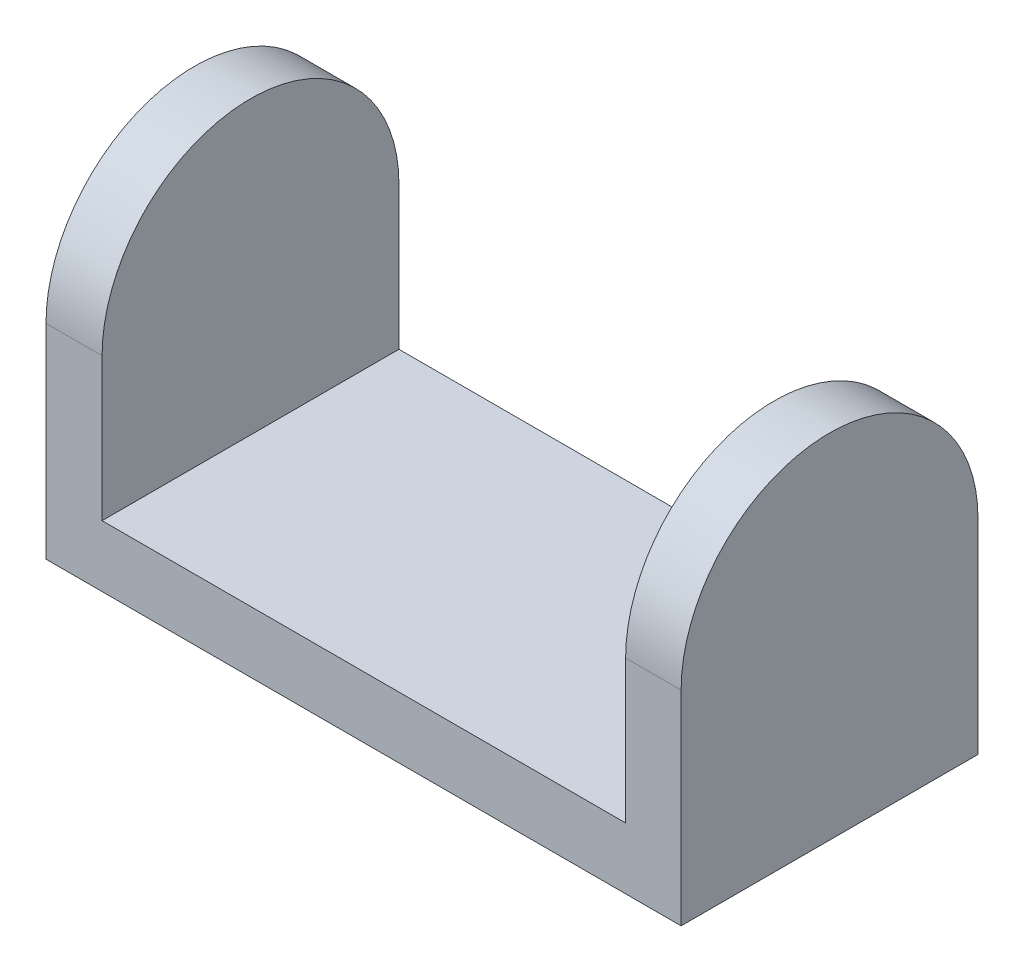
ISO-10303-21;
HEADER;
FILE_DESCRIPTION(('STEP AP214'),'2;1');
FILE_NAME('part.step','',(''),(''),'','','');
FILE_SCHEMA(('AUTOMOTIVE_DESIGN { 1 0 10303 214 1 1 1 1 }'));
ENDSEC;
DATA;
#1=APPLICATION_CONTEXT('core data for automotive mechanical design processes');
#2=APPLICATION_PROTOCOL_DEFINITION('international standard','automotive_design',2000,#1);
#3=PRODUCT_CONTEXT('',#1,'mechanical');
#4=PRODUCT('Part','Part','',(#3));
#5=PRODUCT_RELATED_PRODUCT_CATEGORY('part','',(#4));
#6=PRODUCT_DEFINITION_FORMATION('','',#4);
#7=PRODUCT_DEFINITION_CONTEXT('part definition',#1,'design');
#8=PRODUCT_DEFINITION('design','',#6,#7);
#9=PRODUCT_DEFINITION_SHAPE('','',#8);
#10=(LENGTH_UNIT() NAMED_UNIT(*) SI_UNIT(.MILLI.,.METRE.));
#11=(NAMED_UNIT(*) PLANE_ANGLE_UNIT() SI_UNIT($,.RADIAN.));
#12=(NAMED_UNIT(*) SI_UNIT($,.STERADIAN.) SOLID_ANGLE_UNIT());
#13=UNCERTAINTY_MEASURE_WITH_UNIT(LENGTH_MEASURE(1.E-05),#10,'distance_accuracy_value','');
#14=(GEOMETRIC_REPRESENTATION_CONTEXT(3) GLOBAL_UNCERTAINTY_ASSIGNED_CONTEXT((#13)) GLOBAL_UNIT_ASSIGNED_CONTEXT((#10,
#11,#12)) REPRESENTATION_CONTEXT('',''));
#15=CARTESIAN_POINT('',(0.,0.,0.));
#16=DIRECTION('',(0.,0.,1.));
#17=DIRECTION('',(1.,0.,0.));
#18=AXIS2_PLACEMENT_3D('',#15,#16,#17);
#19=CARTESIAN_POINT('',(0.,5.2,0.));
#20=DIRECTION('',(0.,-1.,0.));
#21=DIRECTION('',(0.,0.,-1.));
#22=AXIS2_PLACEMENT_3D('',#19,#20,#21);
#23=PLANE('',#22);
#24=DIRECTION('',(0.,0.,1.));
#25=VECTOR('',#24,1.);
#26=CARTESIAN_POINT('',(22.2,5.2,-12.575));
#27=LINE('',#26,#25);
#28=CARTESIAN_POINT('',(22.2,5.2,-12.575));
#29=VERTEX_POINT('',#28);
#30=CARTESIAN_POINT('',(22.2,5.2,12.575));
#31=VERTEX_POINT('',#30);
#32=EDGE_CURVE('E109',#29,#31,#27,.T.);
#33=ORIENTED_EDGE('',*,*,#32,.F.);
#34=DIRECTION('',(-1.,0.,0.));
#35=VECTOR('',#34,1.);
#36=CARTESIAN_POINT('',(26.9,5.2,-12.575));
#37=LINE('',#36,#35);
#38=CARTESIAN_POINT('',(-22.15,5.2,-12.575));
#39=VERTEX_POINT('',#38);
#40=EDGE_CURVE('E154',#29,#39,#37,.T.);
#41=ORIENTED_EDGE('',*,*,#40,.T.);
#42=DIRECTION('',(0.,0.,-1.));
#43=VECTOR('',#42,1.);
#44=CARTESIAN_POINT('',(-22.15,5.2,-12.575));
#45=LINE('',#44,#43);
#46=CARTESIAN_POINT('',(-22.15,5.2,12.575));
#47=VERTEX_POINT('',#46);
#48=EDGE_CURVE('E53',#47,#39,#45,.T.);
#49=ORIENTED_EDGE('',*,*,#48,.F.);
#50=DIRECTION('',(1.,0.,0.));
#51=VECTOR('',#50,1.);
#52=CARTESIAN_POINT('',(26.9,5.2,12.575));
#53=LINE('',#52,#51);
#54=EDGE_CURVE('E48',#47,#31,#53,.T.);
#55=ORIENTED_EDGE('',*,*,#54,.T.);
#56=EDGE_LOOP('',(#33,#41,#49,#55));
#57=FACE_BOUND('',#56,.T.);
#58=ADVANCED_FACE('F33',(#57),#23,.F.);
#59=CARTESIAN_POINT('',(-26.9,5.2,-12.575));
#60=DIRECTION('',(1.,0.,0.));
#61=DIRECTION('',(0.,0.,-1.));
#62=AXIS2_PLACEMENT_3D('',#59,#60,#61);
#63=PLANE('',#62);
#64=DIRECTION('',(0.,0.,1.));
#65=VECTOR('',#64,1.);
#66=CARTESIAN_POINT('',(-26.9,0.,-12.575));
#67=LINE('',#66,#65);
#68=CARTESIAN_POINT('',(-26.9,0.,-12.575));
#69=VERTEX_POINT('',#68);
#70=CARTESIAN_POINT('',(-26.9,0.,12.575));
#71=VERTEX_POINT('',#70);
#72=EDGE_CURVE('E152',#69,#71,#67,.T.);
#73=ORIENTED_EDGE('',*,*,#72,.T.);
#74=DIRECTION('',(0.,-1.,0.));
#75=VECTOR('',#74,1.);
#76=CARTESIAN_POINT('',(-26.9,5.2,12.575));
#77=LINE('',#76,#75);
#78=CARTESIAN_POINT('',(-26.9,17.3,12.575));
#79=VERTEX_POINT('',#78);
#80=EDGE_CURVE('E11',#79,#71,#77,.T.);
#81=ORIENTED_EDGE('',*,*,#80,.F.);
#82=CARTESIAN_POINT('',(-26.9,17.3,0.));
#83=DIRECTION('',(-1.,0.,0.));
#84=DIRECTION('',(0.,0.,-1.));
#85=AXIS2_PLACEMENT_3D('',#82,#83,#84);
#86=CIRCLE('',#85,12.575);
#87=CARTESIAN_POINT('',(-26.9,17.3,-12.575));
#88=VERTEX_POINT('',#87);
#89=EDGE_CURVE('E133',#79,#88,#86,.T.);
#90=ORIENTED_EDGE('',*,*,#89,.T.);
#91=DIRECTION('',(0.,-1.,0.));
#92=VECTOR('',#91,1.);
#93=CARTESIAN_POINT('',(-26.9,5.2,-12.575));
#94=LINE('',#93,#92);
#95=EDGE_CURVE('E118',#88,#69,#94,.T.);
#96=ORIENTED_EDGE('',*,*,#95,.T.);
#97=EDGE_LOOP('',(#73,#81,#90,#96));
#98=FACE_BOUND('',#97,.T.);
#99=ADVANCED_FACE('F35',(#98),#63,.F.);
#100=CARTESIAN_POINT('',(26.9,5.2,12.575));
#101=DIRECTION('',(0.,0.,-1.));
#102=DIRECTION('',(-1.,0.,0.));
#103=AXIS2_PLACEMENT_3D('',#100,#101,#102);
#104=PLANE('',#103);
#105=DIRECTION('',(1.,0.,0.));
#106=VECTOR('',#105,1.);
#107=CARTESIAN_POINT('',(26.9,0.,12.575));
#108=LINE('',#107,#106);
#109=CARTESIAN_POINT('',(26.9,0.,12.575));
#110=VERTEX_POINT('',#109);
#111=EDGE_CURVE('E159',#71,#110,#108,.T.);
#112=ORIENTED_EDGE('',*,*,#111,.T.);
#113=DIRECTION('',(0.,-1.,0.));
#114=VECTOR('',#113,1.);
#115=CARTESIAN_POINT('',(26.9,5.2,12.575));
#116=LINE('',#115,#114);
#117=CARTESIAN_POINT('',(26.9,17.3,12.575));
#118=VERTEX_POINT('',#117);
#119=EDGE_CURVE('E41',#118,#110,#116,.T.);
#120=ORIENTED_EDGE('',*,*,#119,.F.);
#121=DIRECTION('',(1.,0.,0.));
#122=VECTOR('',#121,1.);
#123=CARTESIAN_POINT('',(26.9,17.3,12.575));
#124=LINE('',#123,#122);
#125=CARTESIAN_POINT('',(22.2,17.3,12.575));
#126=VERTEX_POINT('',#125);
#127=EDGE_CURVE('E108',#126,#118,#124,.T.);
#128=ORIENTED_EDGE('',*,*,#127,.F.);
#129=DIRECTION('',(0.,-1.,0.));
#130=VECTOR('',#129,1.);
#131=CARTESIAN_POINT('',(22.2,17.3,12.575));
#132=LINE('',#131,#130);
#133=EDGE_CURVE('E128',#126,#31,#132,.T.);
#134=ORIENTED_EDGE('',*,*,#133,.T.);
#135=ORIENTED_EDGE('',*,*,#54,.F.);
#136=DIRECTION('',(0.,-1.,0.));
#137=VECTOR('',#136,1.);
#138=CARTESIAN_POINT('',(-22.15,17.3,12.575));
#139=LINE('',#138,#137);
#140=CARTESIAN_POINT('',(-22.15,17.3,12.575));
#141=VERTEX_POINT('',#140);
#142=EDGE_CURVE('E149',#141,#47,#139,.T.);
#143=ORIENTED_EDGE('',*,*,#142,.F.);
#144=DIRECTION('',(1.,0.,0.));
#145=VECTOR('',#144,1.);
#146=CARTESIAN_POINT('',(-26.9,17.3,12.575));
#147=LINE('',#146,#145);
#148=EDGE_CURVE('E142',#79,#141,#147,.T.);
#149=ORIENTED_EDGE('',*,*,#148,.F.);
#150=ORIENTED_EDGE('',*,*,#80,.T.);
#151=EDGE_LOOP('',(#112,#120,#128,#134,#135,#143,#149,#150));
#152=FACE_BOUND('',#151,.T.);
#153=ADVANCED_FACE('F177',(#152),#104,.F.);
#154=CARTESIAN_POINT('',(26.9,5.2,-12.575));
#155=DIRECTION('',(-1.,0.,0.));
#156=DIRECTION('',(0.,0.,1.));
#157=AXIS2_PLACEMENT_3D('',#154,#155,#156);
#158=PLANE('',#157);
#159=DIRECTION('',(0.,0.,-1.));
#160=VECTOR('',#159,1.);
#161=CARTESIAN_POINT('',(26.9,0.,-12.575));
#162=LINE('',#161,#160);
#163=CARTESIAN_POINT('',(26.9,0.,-12.575));
#164=VERTEX_POINT('',#163);
#165=EDGE_CURVE('E117',#110,#164,#162,.T.);
#166=ORIENTED_EDGE('',*,*,#165,.T.);
#167=DIRECTION('',(0.,-1.,0.));
#168=VECTOR('',#167,1.);
#169=CARTESIAN_POINT('',(26.9,5.2,-12.575));
#170=LINE('',#169,#168);
#171=CARTESIAN_POINT('',(26.9,17.3,-12.575));
#172=VERTEX_POINT('',#171);
#173=EDGE_CURVE('E100',#172,#164,#170,.T.);
#174=ORIENTED_EDGE('',*,*,#173,.F.);
#175=CARTESIAN_POINT('',(26.9,17.3,0.));
#176=DIRECTION('',(1.,0.,0.));
#177=DIRECTION('',(0.,0.,-1.));
#178=AXIS2_PLACEMENT_3D('',#175,#176,#177);
#179=CIRCLE('',#178,12.575);
#180=EDGE_CURVE('E115',#172,#118,#179,.T.);
#181=ORIENTED_EDGE('',*,*,#180,.T.);
#182=ORIENTED_EDGE('',*,*,#119,.T.);
#183=EDGE_LOOP('',(#166,#174,#181,#182));
#184=FACE_BOUND('',#183,.T.);
#185=ADVANCED_FACE('F113',(#184),#158,.F.);
#186=CARTESIAN_POINT('',(26.9,5.2,-12.575));
#187=DIRECTION('',(0.,0.,1.));
#188=DIRECTION('',(1.,0.,0.));
#189=AXIS2_PLACEMENT_3D('',#186,#187,#188);
#190=PLANE('',#189);
#191=DIRECTION('',(-1.,0.,0.));
#192=VECTOR('',#191,1.);
#193=CARTESIAN_POINT('',(26.9,0.,-12.575));
#194=LINE('',#193,#192);
#195=EDGE_CURVE('E155',#164,#69,#194,.T.);
#196=ORIENTED_EDGE('',*,*,#195,.T.);
#197=ORIENTED_EDGE('',*,*,#95,.F.);
#198=DIRECTION('',(-1.,0.,0.));
#199=VECTOR('',#198,1.);
#200=CARTESIAN_POINT('',(-26.9,17.3,-12.575));
#201=LINE('',#200,#199);
#202=CARTESIAN_POINT('',(-22.15,17.3,-12.575));
#203=VERTEX_POINT('',#202);
#204=EDGE_CURVE('E139',#203,#88,#201,.T.);
#205=ORIENTED_EDGE('',*,*,#204,.F.);
#206=DIRECTION('',(0.,-1.,0.));
#207=VECTOR('',#206,1.);
#208=CARTESIAN_POINT('',(-22.15,17.3,-12.575));
#209=LINE('',#208,#207);
#210=EDGE_CURVE('E145',#203,#39,#209,.T.);
#211=ORIENTED_EDGE('',*,*,#210,.T.);
#212=ORIENTED_EDGE('',*,*,#40,.F.);
#213=DIRECTION('',(0.,-1.,0.));
#214=VECTOR('',#213,1.);
#215=CARTESIAN_POINT('',(22.2,17.3,-12.575));
#216=LINE('',#215,#214);
#217=CARTESIAN_POINT('',(22.2,17.3,-12.575));
#218=VERTEX_POINT('',#217);
#219=EDGE_CURVE('E103',#218,#29,#216,.T.);
#220=ORIENTED_EDGE('',*,*,#219,.F.);
#221=DIRECTION('',(-1.,0.,0.));
#222=VECTOR('',#221,1.);
#223=CARTESIAN_POINT('',(26.9,17.3,-12.575));
#224=LINE('',#223,#222);
#225=EDGE_CURVE('E97',#172,#218,#224,.T.);
#226=ORIENTED_EDGE('',*,*,#225,.F.);
#227=ORIENTED_EDGE('',*,*,#173,.T.);
#228=EDGE_LOOP('',(#196,#197,#205,#211,#212,#220,#226,#227));
#229=FACE_BOUND('',#228,.T.);
#230=ADVANCED_FACE('F99',(#229),#190,.F.);
#231=CARTESIAN_POINT('',(0.,0.,0.));
#232=DIRECTION('',(0.,-1.,0.));
#233=DIRECTION('',(0.,0.,-1.));
#234=AXIS2_PLACEMENT_3D('',#231,#232,#233);
#235=PLANE('',#234);
#236=ORIENTED_EDGE('',*,*,#72,.F.);
#237=ORIENTED_EDGE('',*,*,#195,.F.);
#238=ORIENTED_EDGE('',*,*,#165,.F.);
#239=ORIENTED_EDGE('',*,*,#111,.F.);
#240=EDGE_LOOP('',(#236,#237,#238,#239));
#241=FACE_BOUND('',#240,.T.);
#242=ADVANCED_FACE('F167',(#241),#235,.T.);
#243=CARTESIAN_POINT('',(-22.15,17.3,-12.575));
#244=DIRECTION('',(-1.,0.,0.));
#245=DIRECTION('',(0.,0.,1.));
#246=AXIS2_PLACEMENT_3D('',#243,#244,#245);
#247=PLANE('',#246);
#248=ORIENTED_EDGE('',*,*,#48,.T.);
#249=ORIENTED_EDGE('',*,*,#210,.F.);
#250=CARTESIAN_POINT('',(-22.15,17.3,0.));
#251=DIRECTION('',(-1.,0.,0.));
#252=DIRECTION('',(0.,0.,-1.));
#253=AXIS2_PLACEMENT_3D('',#250,#251,#252);
#254=CIRCLE('',#253,12.575);
#255=EDGE_CURVE('E134',#141,#203,#254,.T.);
#256=ORIENTED_EDGE('',*,*,#255,.F.);
#257=ORIENTED_EDGE('',*,*,#142,.T.);
#258=EDGE_LOOP('',(#248,#249,#256,#257));
#259=FACE_BOUND('',#258,.T.);
#260=ADVANCED_FACE('F176',(#259),#247,.F.);
#261=CARTESIAN_POINT('',(-22.15,17.3,0.));
#262=DIRECTION('',(-1.,0.,0.));
#263=DIRECTION('',(0.,0.,1.));
#264=AXIS2_PLACEMENT_3D('',#261,#262,#263);
#265=CYLINDRICAL_SURFACE('',#264,12.575);
#266=ORIENTED_EDGE('',*,*,#89,.F.);
#267=ORIENTED_EDGE('',*,*,#148,.T.);
#268=ORIENTED_EDGE('',*,*,#255,.T.);
#269=ORIENTED_EDGE('',*,*,#204,.T.);
#270=EDGE_LOOP('',(#266,#267,#268,#269));
#271=FACE_BOUND('',#270,.T.);
#272=ADVANCED_FACE('F173',(#271),#265,.T.);
#273=CARTESIAN_POINT('',(22.2,17.3,-12.575));
#274=DIRECTION('',(1.,0.,0.));
#275=DIRECTION('',(0.,0.,-1.));
#276=AXIS2_PLACEMENT_3D('',#273,#274,#275);
#277=PLANE('',#276);
#278=ORIENTED_EDGE('',*,*,#32,.T.);
#279=ORIENTED_EDGE('',*,*,#133,.F.);
#280=CARTESIAN_POINT('',(22.2,17.3,0.));
#281=DIRECTION('',(1.,0.,0.));
#282=DIRECTION('',(0.,0.,-1.));
#283=AXIS2_PLACEMENT_3D('',#280,#281,#282);
#284=CIRCLE('',#283,12.575);
#285=EDGE_CURVE('E123',#218,#126,#284,.T.);
#286=ORIENTED_EDGE('',*,*,#285,.F.);
#287=ORIENTED_EDGE('',*,*,#219,.T.);
#288=EDGE_LOOP('',(#278,#279,#286,#287));
#289=FACE_BOUND('',#288,.T.);
#290=ADVANCED_FACE('F179',(#289),#277,.F.);
#291=CARTESIAN_POINT('',(22.2,17.3,0.));
#292=DIRECTION('',(1.,0.,0.));
#293=DIRECTION('',(0.,0.,-1.));
#294=AXIS2_PLACEMENT_3D('',#291,#292,#293);
#295=CYLINDRICAL_SURFACE('',#294,12.575);
#296=ORIENTED_EDGE('',*,*,#180,.F.);
#297=ORIENTED_EDGE('',*,*,#225,.T.);
#298=ORIENTED_EDGE('',*,*,#285,.T.);
#299=ORIENTED_EDGE('',*,*,#127,.T.);
#300=EDGE_LOOP('',(#296,#297,#298,#299));
#301=FACE_BOUND('',#300,.T.);
#302=ADVANCED_FACE('F121',(#301),#295,.T.);
#303=CLOSED_SHELL('',(#58,#99,#153,#185,#230,#242,#260,#272,#290,#302));
#304=MANIFOLD_SOLID_BREP('B2',#303);
#305=ADVANCED_BREP_SHAPE_REPRESENTATION('',(#18,#304),#14);
#306=SHAPE_DEFINITION_REPRESENTATION(#9,#305);
ENDSEC;
END-ISO-10303-21;
